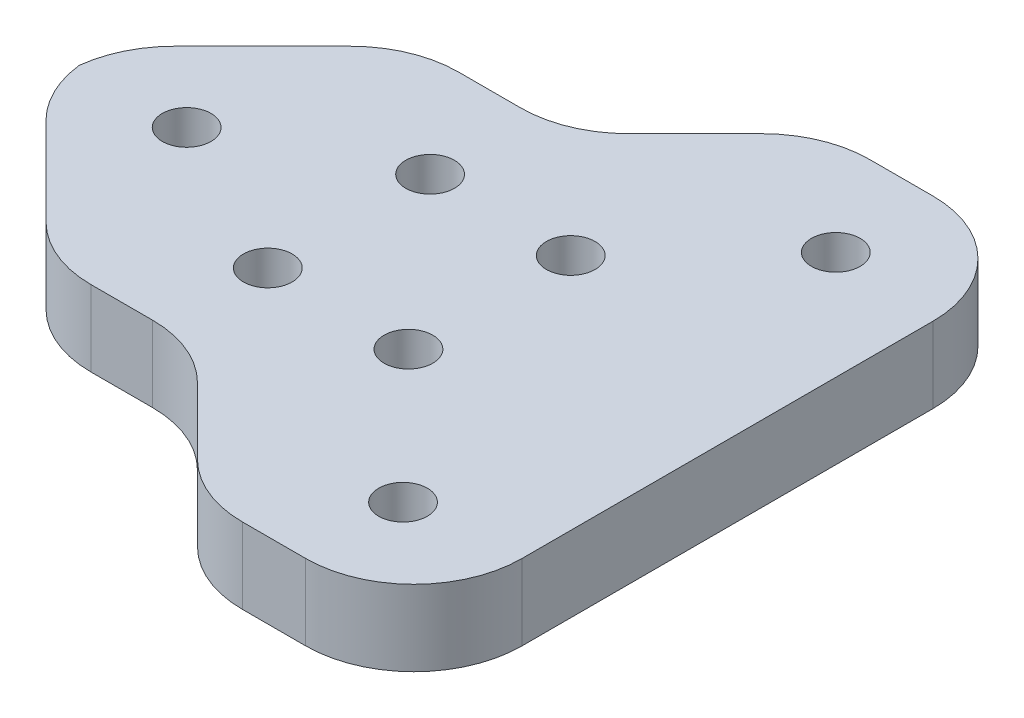
ISO-10303-21;
HEADER;
FILE_DESCRIPTION(('STEP AP214'),'2;1');
FILE_NAME('part.step','',(''),(''),'','','');
FILE_SCHEMA(('AUTOMOTIVE_DESIGN { 1 0 10303 214 1 1 1 1 }'));
ENDSEC;
DATA;
#1=APPLICATION_CONTEXT('core data for automotive mechanical design processes');
#2=APPLICATION_PROTOCOL_DEFINITION('international standard','automotive_design',2000,#1);
#3=PRODUCT_CONTEXT('',#1,'mechanical');
#4=PRODUCT('Part','Part','',(#3));
#5=PRODUCT_RELATED_PRODUCT_CATEGORY('part','',(#4));
#6=PRODUCT_DEFINITION_FORMATION('','',#4);
#7=PRODUCT_DEFINITION_CONTEXT('part definition',#1,'design');
#8=PRODUCT_DEFINITION('design','',#6,#7);
#9=PRODUCT_DEFINITION_SHAPE('','',#8);
#10=(LENGTH_UNIT() NAMED_UNIT(*) SI_UNIT(.MILLI.,.METRE.));
#11=(NAMED_UNIT(*) PLANE_ANGLE_UNIT() SI_UNIT($,.RADIAN.));
#12=(NAMED_UNIT(*) SI_UNIT($,.STERADIAN.) SOLID_ANGLE_UNIT());
#13=UNCERTAINTY_MEASURE_WITH_UNIT(LENGTH_MEASURE(1.E-05),#10,'distance_accuracy_value','');
#14=(GEOMETRIC_REPRESENTATION_CONTEXT(3) GLOBAL_UNCERTAINTY_ASSIGNED_CONTEXT((#13)) GLOBAL_UNIT_ASSIGNED_CONTEXT((#10,
#11,#12)) REPRESENTATION_CONTEXT('',''));
#15=CARTESIAN_POINT('',(0.,0.,0.));
#16=DIRECTION('',(0.,0.,1.));
#17=DIRECTION('',(1.,0.,0.));
#18=AXIS2_PLACEMENT_3D('',#15,#16,#17);
#19=CARTESIAN_POINT('',(0.,7.,0.));
#20=DIRECTION('',(0.,0.,-1.));
#21=DIRECTION('',(-1.,0.,0.));
#22=AXIS2_PLACEMENT_3D('',#19,#20,#21);
#23=PLANE('',#22);
#24=DIRECTION('',(1.,0.,0.));
#25=VECTOR('',#24,1.);
#26=CARTESIAN_POINT('',(0.,0.,0.));
#27=LINE('',#26,#25);
#28=CARTESIAN_POINT('',(44.1421356237306,0.,0.));
#29=VERTEX_POINT('',#28);
#30=CARTESIAN_POINT('',(50.,0.,0.));
#31=VERTEX_POINT('',#30);
#32=EDGE_CURVE('E204',#29,#31,#27,.T.);
#33=ORIENTED_EDGE('',*,*,#32,.T.);
#34=DIRECTION('',(0.,-1.,0.));
#35=VECTOR('',#34,1.);
#36=CARTESIAN_POINT('',(50.,7.,0.));
#37=LINE('',#36,#35);
#38=CARTESIAN_POINT('',(50.,7.,0.));
#39=VERTEX_POINT('',#38);
#40=EDGE_CURVE('E178',#31,#39,#37,.F.);
#41=ORIENTED_EDGE('',*,*,#40,.T.);
#42=DIRECTION('',(1.,0.,0.));
#43=VECTOR('',#42,1.);
#44=CARTESIAN_POINT('',(0.,7.,0.));
#45=LINE('',#44,#43);
#46=CARTESIAN_POINT('',(44.1421356237306,7.,0.));
#47=VERTEX_POINT('',#46);
#48=EDGE_CURVE('E209',#47,#39,#45,.T.);
#49=ORIENTED_EDGE('',*,*,#48,.F.);
#50=DIRECTION('',(0.,-1.,0.));
#51=VECTOR('',#50,1.);
#52=CARTESIAN_POINT('',(44.1421356237306,7.,0.));
#53=LINE('',#52,#51);
#54=EDGE_CURVE('E184',#47,#29,#53,.T.);
#55=ORIENTED_EDGE('',*,*,#54,.T.);
#56=EDGE_LOOP('',(#33,#41,#49,#55));
#57=FACE_BOUND('',#56,.T.);
#58=ADVANCED_FACE('F39',(#57),#23,.F.);
#59=CARTESIAN_POINT('',(60.,7.,0.));
#60=DIRECTION('',(-1.,0.,0.));
#61=DIRECTION('',(0.,0.,1.));
#62=AXIS2_PLACEMENT_3D('',#59,#60,#61);
#63=PLANE('',#62);
#64=DIRECTION('',(0.,0.,-1.));
#65=VECTOR('',#64,1.);
#66=CARTESIAN_POINT('',(60.,7.,0.));
#67=LINE('',#66,#65);
#68=CARTESIAN_POINT('',(60.,7.,-10.));
#69=VERTEX_POINT('',#68);
#70=CARTESIAN_POINT('',(60.,7.,-48.));
#71=VERTEX_POINT('',#70);
#72=EDGE_CURVE('E194',#69,#71,#67,.T.);
#73=ORIENTED_EDGE('',*,*,#72,.F.);
#74=DIRECTION('',(0.,-1.,0.));
#75=VECTOR('',#74,1.);
#76=CARTESIAN_POINT('',(60.,7.,-10.));
#77=LINE('',#76,#75);
#78=CARTESIAN_POINT('',(60.,0.,-10.));
#79=VERTEX_POINT('',#78);
#80=EDGE_CURVE('E177',#69,#79,#77,.T.);
#81=ORIENTED_EDGE('',*,*,#80,.T.);
#82=DIRECTION('',(0.,0.,-1.));
#83=VECTOR('',#82,1.);
#84=CARTESIAN_POINT('',(60.,0.,0.));
#85=LINE('',#84,#83);
#86=CARTESIAN_POINT('',(60.,0.,-48.));
#87=VERTEX_POINT('',#86);
#88=EDGE_CURVE('E191',#79,#87,#85,.T.);
#89=ORIENTED_EDGE('',*,*,#88,.T.);
#90=DIRECTION('',(0.,-1.,0.));
#91=VECTOR('',#90,1.);
#92=CARTESIAN_POINT('',(60.,7.,-48.));
#93=LINE('',#92,#91);
#94=EDGE_CURVE('E197',#87,#71,#93,.F.);
#95=ORIENTED_EDGE('',*,*,#94,.T.);
#96=EDGE_LOOP('',(#73,#81,#89,#95));
#97=FACE_BOUND('',#96,.T.);
#98=ADVANCED_FACE('F190',(#97),#63,.F.);
#99=CARTESIAN_POINT('',(0.,7.,-58.));
#100=DIRECTION('',(0.,0.,1.));
#101=DIRECTION('',(1.,0.,0.));
#102=AXIS2_PLACEMENT_3D('',#99,#100,#101);
#103=PLANE('',#102);
#104=DIRECTION('',(-1.,0.,0.));
#105=VECTOR('',#104,1.);
#106=CARTESIAN_POINT('',(0.,7.,-58.));
#107=LINE('',#106,#105);
#108=CARTESIAN_POINT('',(50.,7.,-58.));
#109=VERTEX_POINT('',#108);
#110=CARTESIAN_POINT('',(44.1421356237306,7.,-58.));
#111=VERTEX_POINT('',#110);
#112=EDGE_CURVE('E216',#109,#111,#107,.T.);
#113=ORIENTED_EDGE('',*,*,#112,.F.);
#114=DIRECTION('',(0.,-1.,0.));
#115=VECTOR('',#114,1.);
#116=CARTESIAN_POINT('',(50.,7.,-58.));
#117=LINE('',#116,#115);
#118=CARTESIAN_POINT('',(50.,0.,-58.));
#119=VERTEX_POINT('',#118);
#120=EDGE_CURVE('E268',#109,#119,#117,.T.);
#121=ORIENTED_EDGE('',*,*,#120,.T.);
#122=DIRECTION('',(-1.,0.,0.));
#123=VECTOR('',#122,1.);
#124=CARTESIAN_POINT('',(0.,0.,-58.));
#125=LINE('',#124,#123);
#126=CARTESIAN_POINT('',(44.1421356237306,0.,-58.));
#127=VERTEX_POINT('',#126);
#128=EDGE_CURVE('E203',#119,#127,#125,.T.);
#129=ORIENTED_EDGE('',*,*,#128,.T.);
#130=DIRECTION('',(0.,-1.,0.));
#131=VECTOR('',#130,1.);
#132=CARTESIAN_POINT('',(44.1421356237306,7.,-58.));
#133=LINE('',#132,#131);
#134=EDGE_CURVE('E265',#127,#111,#133,.F.);
#135=ORIENTED_EDGE('',*,*,#134,.T.);
#136=EDGE_LOOP('',(#113,#121,#129,#135));
#137=FACE_BOUND('',#136,.T.);
#138=ADVANCED_FACE('F505',(#137),#103,.F.);
#139=CARTESIAN_POINT('',(0.,7.,0.));
#140=DIRECTION('',(0.,-1.,0.));
#141=DIRECTION('',(0.,0.,-1.));
#142=AXIS2_PLACEMENT_3D('',#139,#140,#141);
#143=PLANE('',#142);
#144=CARTESIAN_POINT('',(50.,7.,-49.));
#145=DIRECTION('',(0.,-1.,0.));
#146=DIRECTION('',(0.,0.,-1.));
#147=AXIS2_PLACEMENT_3D('',#144,#145,#146);
#148=CIRCLE('',#147,2.25);
#149=CARTESIAN_POINT('',(50.,7.,-51.25));
#150=VERTEX_POINT('',#149);
#151=EDGE_CURVE('E354',#150,#150,#148,.T.);
#152=ORIENTED_EDGE('',*,*,#151,.T.);
#153=EDGE_LOOP('',(#152));
#154=FACE_BOUND('',#153,.T.);
#155=CARTESIAN_POINT('',(50.,7.,-9.00000000000001));
#156=DIRECTION('',(0.,-1.,0.));
#157=DIRECTION('',(0.,0.,-1.));
#158=AXIS2_PLACEMENT_3D('',#155,#156,#157);
#159=CIRCLE('',#158,2.25);
#160=CARTESIAN_POINT('',(50.,7.,-11.25));
#161=VERTEX_POINT('',#160);
#162=EDGE_CURVE('E394',#161,#161,#159,.T.);
#163=ORIENTED_EDGE('',*,*,#162,.T.);
#164=EDGE_LOOP('',(#163));
#165=FACE_BOUND('',#164,.T.);
#166=CARTESIAN_POINT('',(10.,7.,-29.));
#167=DIRECTION('',(0.,-1.,0.));
#168=DIRECTION('',(0.,0.,-1.));
#169=AXIS2_PLACEMENT_3D('',#166,#167,#168);
#170=CIRCLE('',#169,2.25);
#171=CARTESIAN_POINT('',(10.,7.,-31.25));
#172=VERTEX_POINT('',#171);
#173=EDGE_CURVE('E402',#172,#172,#170,.T.);
#174=ORIENTED_EDGE('',*,*,#173,.T.);
#175=EDGE_LOOP('',(#174));
#176=FACE_BOUND('',#175,.T.);
#177=CARTESIAN_POINT('',(38.,7.,-36.5));
#178=DIRECTION('',(0.,-1.,0.));
#179=DIRECTION('',(0.,0.,-1.));
#180=AXIS2_PLACEMENT_3D('',#177,#178,#179);
#181=CIRCLE('',#180,2.25);
#182=CARTESIAN_POINT('',(38.,7.,-38.75));
#183=VERTEX_POINT('',#182);
#184=EDGE_CURVE('E410',#183,#183,#181,.T.);
#185=ORIENTED_EDGE('',*,*,#184,.T.);
#186=EDGE_LOOP('',(#185));
#187=FACE_BOUND('',#186,.T.);
#188=CARTESIAN_POINT('',(38.,7.,-21.5));
#189=DIRECTION('',(0.,-1.,0.));
#190=DIRECTION('',(0.,0.,-1.));
#191=AXIS2_PLACEMENT_3D('',#188,#189,#190);
#192=CIRCLE('',#191,2.25);
#193=CARTESIAN_POINT('',(38.,7.,-23.75));
#194=VERTEX_POINT('',#193);
#195=EDGE_CURVE('E418',#194,#194,#192,.T.);
#196=ORIENTED_EDGE('',*,*,#195,.T.);
#197=EDGE_LOOP('',(#196));
#198=FACE_BOUND('',#197,.T.);
#199=CARTESIAN_POINT('',(25.,7.,-36.5));
#200=DIRECTION('',(0.,-1.,0.));
#201=DIRECTION('',(0.,0.,-1.));
#202=AXIS2_PLACEMENT_3D('',#199,#200,#201);
#203=CIRCLE('',#202,2.25);
#204=CARTESIAN_POINT('',(25.,7.,-38.75));
#205=VERTEX_POINT('',#204);
#206=EDGE_CURVE('E426',#205,#205,#203,.T.);
#207=ORIENTED_EDGE('',*,*,#206,.T.);
#208=EDGE_LOOP('',(#207));
#209=FACE_BOUND('',#208,.T.);
#210=CARTESIAN_POINT('',(25.,7.,-21.5));
#211=DIRECTION('',(0.,-1.,0.));
#212=DIRECTION('',(0.,0.,-1.));
#213=AXIS2_PLACEMENT_3D('',#210,#211,#212);
#214=CIRCLE('',#213,2.25);
#215=CARTESIAN_POINT('',(25.,7.,-23.75));
#216=VERTEX_POINT('',#215);
#217=EDGE_CURVE('E211',#216,#216,#214,.T.);
#218=ORIENTED_EDGE('',*,*,#217,.T.);
#219=EDGE_LOOP('',(#218));
#220=FACE_BOUND('',#219,.T.);
#221=ORIENTED_EDGE('',*,*,#48,.T.);
#222=CARTESIAN_POINT('',(50.,7.,-10.));
#223=DIRECTION('',(0.,-1.,0.));
#224=DIRECTION('',(0.,0.,-1.));
#225=AXIS2_PLACEMENT_3D('',#222,#223,#224);
#226=CIRCLE('',#225,10.);
#227=EDGE_CURVE('E262',#39,#69,#226,.F.);
#228=ORIENTED_EDGE('',*,*,#227,.T.);
#229=ORIENTED_EDGE('',*,*,#72,.T.);
#230=CARTESIAN_POINT('',(50.,7.,-48.));
#231=DIRECTION('',(0.,-1.,0.));
#232=DIRECTION('',(0.,0.,-1.));
#233=AXIS2_PLACEMENT_3D('',#230,#231,#232);
#234=CIRCLE('',#233,10.);
#235=EDGE_CURVE('E259',#71,#109,#234,.F.);
#236=ORIENTED_EDGE('',*,*,#235,.T.);
#237=ORIENTED_EDGE('',*,*,#112,.T.);
#238=CARTESIAN_POINT('',(44.1421356237306,7.,-48.));
#239=DIRECTION('',(0.,-1.,0.));
#240=DIRECTION('',(0.,0.,-1.));
#241=AXIS2_PLACEMENT_3D('',#238,#239,#240);
#242=CIRCLE('',#241,10.);
#243=CARTESIAN_POINT('',(37.071067811865,7.,-55.0710678118654));
#244=VERTEX_POINT('',#243);
#245=EDGE_CURVE('E256',#111,#244,#242,.F.);
#246=ORIENTED_EDGE('',*,*,#245,.T.);
#247=DIRECTION('',(-0.707106781186541,0.,0.707106781186554));
#248=VECTOR('',#247,1.);
#249=CARTESIAN_POINT('',(39.9999999999996,7.,-58.));
#250=LINE('',#249,#248);
#251=CARTESIAN_POINT('',(30.9289321881343,7.,-48.9289321881346));
#252=VERTEX_POINT('',#251);
#253=EDGE_CURVE('E368',#244,#252,#250,.T.);
#254=ORIENTED_EDGE('',*,*,#253,.T.);
#255=CARTESIAN_POINT('',(23.8578643762688,7.,-56.));
#256=DIRECTION('',(0.,-1.,0.));
#257=DIRECTION('',(0.,0.,-1.));
#258=AXIS2_PLACEMENT_3D('',#255,#256,#257);
#259=CIRCLE('',#258,10.);
#260=CARTESIAN_POINT('',(23.8578643762688,7.,-46.));
#261=VERTEX_POINT('',#260);
#262=EDGE_CURVE('E316',#252,#261,#259,.T.);
#263=ORIENTED_EDGE('',*,*,#262,.T.);
#264=DIRECTION('',(-1.,0.,0.));
#265=VECTOR('',#264,1.);
#266=CARTESIAN_POINT('',(27.9999999999998,7.,-46.));
#267=LINE('',#266,#265);
#268=CARTESIAN_POINT('',(18.1421356237308,7.,-46.));
#269=VERTEX_POINT('',#268);
#270=EDGE_CURVE('E361',#261,#269,#267,.T.);
#271=ORIENTED_EDGE('',*,*,#270,.T.);
#272=CARTESIAN_POINT('',(18.1421356237308,7.,-36.));
#273=DIRECTION('',(0.,-1.,0.));
#274=DIRECTION('',(0.,0.,-1.));
#275=AXIS2_PLACEMENT_3D('',#272,#273,#274);
#276=CIRCLE('',#275,10.);
#277=CARTESIAN_POINT('',(11.0710678118652,7.,-43.0710678118654));
#278=VERTEX_POINT('',#277);
#279=EDGE_CURVE('E253',#269,#278,#276,.F.);
#280=ORIENTED_EDGE('',*,*,#279,.T.);
#281=DIRECTION('',(-0.707106781186541,0.,0.707106781186554));
#282=VECTOR('',#281,1.);
#283=CARTESIAN_POINT('',(13.9999999999998,7.,-46.));
#284=LINE('',#283,#282);
#285=CARTESIAN_POINT('',(2.92893218813446,7.,-34.9289321881345));
#286=VERTEX_POINT('',#285);
#287=EDGE_CURVE('E365',#278,#286,#284,.T.);
#288=ORIENTED_EDGE('',*,*,#287,.T.);
#289=CARTESIAN_POINT('',(10.,7.,-27.8578643762691));
#290=DIRECTION('',(0.,-1.,0.));
#291=DIRECTION('',(0.,0.,-1.));
#292=AXIS2_PLACEMENT_3D('',#289,#290,#291);
#293=CIRCLE('',#292,10.);
#294=CARTESIAN_POINT('',(0.065437794396531,7.,-29.));
#295=VERTEX_POINT('',#294);
#296=EDGE_CURVE('E56',#286,#295,#293,.F.);
#297=ORIENTED_EDGE('',*,*,#296,.T.);
#298=CARTESIAN_POINT('',(10.,7.,-30.1421356237309));
#299=DIRECTION('',(0.,-1.,0.));
#300=DIRECTION('',(0.,0.,-1.));
#301=AXIS2_PLACEMENT_3D('',#298,#299,#300);
#302=CIRCLE('',#301,10.);
#303=CARTESIAN_POINT('',(2.92893218813446,7.,-23.0710678118655));
#304=VERTEX_POINT('',#303);
#305=EDGE_CURVE('E248',#295,#304,#302,.F.);
#306=ORIENTED_EDGE('',*,*,#305,.T.);
#307=DIRECTION('',(0.707106781186542,0.,0.707106781186554));
#308=VECTOR('',#307,1.);
#309=CARTESIAN_POINT('',(13.9999999999998,7.,-12.));
#310=LINE('',#309,#308);
#311=CARTESIAN_POINT('',(11.0710678118652,7.,-14.9289321881346));
#312=VERTEX_POINT('',#311);
#313=EDGE_CURVE('E356',#304,#312,#310,.T.);
#314=ORIENTED_EDGE('',*,*,#313,.T.);
#315=CARTESIAN_POINT('',(18.1421356237308,7.,-22.));
#316=DIRECTION('',(0.,-1.,0.));
#317=DIRECTION('',(0.,0.,-1.));
#318=AXIS2_PLACEMENT_3D('',#315,#316,#317);
#319=CIRCLE('',#318,10.);
#320=CARTESIAN_POINT('',(18.1421356237308,7.,-12.));
#321=VERTEX_POINT('',#320);
#322=EDGE_CURVE('E245',#312,#321,#319,.F.);
#323=ORIENTED_EDGE('',*,*,#322,.T.);
#324=DIRECTION('',(1.,0.,0.));
#325=VECTOR('',#324,1.);
#326=CARTESIAN_POINT('',(27.9999999999998,7.,-12.));
#327=LINE('',#326,#325);
#328=CARTESIAN_POINT('',(23.8578643762688,7.,-12.));
#329=VERTEX_POINT('',#328);
#330=EDGE_CURVE('E344',#321,#329,#327,.T.);
#331=ORIENTED_EDGE('',*,*,#330,.T.);
#332=CARTESIAN_POINT('',(23.8578643762688,7.,-2.));
#333=DIRECTION('',(0.,-1.,0.));
#334=DIRECTION('',(0.,0.,-1.));
#335=AXIS2_PLACEMENT_3D('',#332,#333,#334);
#336=CIRCLE('',#335,10.);
#337=CARTESIAN_POINT('',(30.9289321881343,7.,-9.07106781186542));
#338=VERTEX_POINT('',#337);
#339=EDGE_CURVE('E11',#329,#338,#336,.T.);
#340=ORIENTED_EDGE('',*,*,#339,.T.);
#341=DIRECTION('',(0.707106781186542,0.,0.707106781186553));
#342=VECTOR('',#341,1.);
#343=CARTESIAN_POINT('',(39.9999999999996,7.,0.));
#344=LINE('',#343,#342);
#345=CARTESIAN_POINT('',(37.071067811865,7.,-2.92893218813459));
#346=VERTEX_POINT('',#345);
#347=EDGE_CURVE('E342',#338,#346,#344,.T.);
#348=ORIENTED_EDGE('',*,*,#347,.T.);
#349=CARTESIAN_POINT('',(44.1421356237306,7.,-10.));
#350=DIRECTION('',(0.,-1.,0.));
#351=DIRECTION('',(0.,0.,-1.));
#352=AXIS2_PLACEMENT_3D('',#349,#350,#351);
#353=CIRCLE('',#352,10.);
#354=EDGE_CURVE('E242',#346,#47,#353,.F.);
#355=ORIENTED_EDGE('',*,*,#354,.T.);
#356=EDGE_LOOP('',(#221,#228,#229,#236,#237,#246,#254,#263,#271,#280,#288,#297,#306,#314,#323,
#331,#340,#348,#355));
#357=FACE_BOUND('',#356,.T.);
#358=ADVANCED_FACE('F341',(#154,#165,#176,#187,#198,#209,#220,#357),#143,.F.);
#359=CARTESIAN_POINT('',(0.,0.,0.));
#360=DIRECTION('',(0.,-1.,0.));
#361=DIRECTION('',(0.,0.,-1.));
#362=AXIS2_PLACEMENT_3D('',#359,#360,#361);
#363=PLANE('',#362);
#364=ORIENTED_EDGE('',*,*,#88,.F.);
#365=CARTESIAN_POINT('',(50.,0.,-10.));
#366=DIRECTION('',(0.,-1.,0.));
#367=DIRECTION('',(0.,0.,-1.));
#368=AXIS2_PLACEMENT_3D('',#365,#366,#367);
#369=CIRCLE('',#368,10.);
#370=EDGE_CURVE('E173',#79,#31,#369,.T.);
#371=ORIENTED_EDGE('',*,*,#370,.T.);
#372=ORIENTED_EDGE('',*,*,#32,.F.);
#373=CARTESIAN_POINT('',(44.1421356237306,0.,-10.));
#374=DIRECTION('',(0.,-1.,0.));
#375=DIRECTION('',(0.,0.,-1.));
#376=AXIS2_PLACEMENT_3D('',#373,#374,#375);
#377=CIRCLE('',#376,10.);
#378=CARTESIAN_POINT('',(37.071067811865,0.,-2.92893218813459));
#379=VERTEX_POINT('',#378);
#380=EDGE_CURVE('E196',#29,#379,#377,.T.);
#381=ORIENTED_EDGE('',*,*,#380,.T.);
#382=DIRECTION('',(0.707106781186542,0.,0.707106781186553));
#383=VECTOR('',#382,1.);
#384=CARTESIAN_POINT('',(39.9999999999996,0.,0.));
#385=LINE('',#384,#383);
#386=CARTESIAN_POINT('',(30.9289321881343,0.,-9.07106781186542));
#387=VERTEX_POINT('',#386);
#388=EDGE_CURVE('E325',#387,#379,#385,.T.);
#389=ORIENTED_EDGE('',*,*,#388,.F.);
#390=CARTESIAN_POINT('',(23.8578643762688,0.,-2.));
#391=DIRECTION('',(0.,-1.,0.));
#392=DIRECTION('',(0.,0.,-1.));
#393=AXIS2_PLACEMENT_3D('',#390,#391,#392);
#394=CIRCLE('',#393,10.);
#395=CARTESIAN_POINT('',(23.8578643762688,0.,-12.));
#396=VERTEX_POINT('',#395);
#397=EDGE_CURVE('E49',#387,#396,#394,.F.);
#398=ORIENTED_EDGE('',*,*,#397,.T.);
#399=DIRECTION('',(1.,0.,0.));
#400=VECTOR('',#399,1.);
#401=CARTESIAN_POINT('',(27.9999999999998,0.,-12.));
#402=LINE('',#401,#400);
#403=CARTESIAN_POINT('',(18.1421356237308,0.,-12.));
#404=VERTEX_POINT('',#403);
#405=EDGE_CURVE('E323',#404,#396,#402,.T.);
#406=ORIENTED_EDGE('',*,*,#405,.F.);
#407=CARTESIAN_POINT('',(18.1421356237308,0.,-22.));
#408=DIRECTION('',(0.,-1.,0.));
#409=DIRECTION('',(0.,0.,-1.));
#410=AXIS2_PLACEMENT_3D('',#407,#408,#409);
#411=CIRCLE('',#410,10.);
#412=CARTESIAN_POINT('',(11.0710678118652,0.,-14.9289321881346));
#413=VERTEX_POINT('',#412);
#414=EDGE_CURVE('E220',#404,#413,#411,.T.);
#415=ORIENTED_EDGE('',*,*,#414,.T.);
#416=DIRECTION('',(0.707106781186542,0.,0.707106781186554));
#417=VECTOR('',#416,1.);
#418=CARTESIAN_POINT('',(13.9999999999998,0.,-12.));
#419=LINE('',#418,#417);
#420=CARTESIAN_POINT('',(2.92893218813446,0.,-23.0710678118655));
#421=VERTEX_POINT('',#420);
#422=EDGE_CURVE('E335',#421,#413,#419,.T.);
#423=ORIENTED_EDGE('',*,*,#422,.F.);
#424=CARTESIAN_POINT('',(10.,0.,-30.1421356237309));
#425=DIRECTION('',(0.,-1.,0.));
#426=DIRECTION('',(0.,0.,-1.));
#427=AXIS2_PLACEMENT_3D('',#424,#425,#426);
#428=CIRCLE('',#427,10.);
#429=CARTESIAN_POINT('',(0.065437794396531,0.,-29.));
#430=VERTEX_POINT('',#429);
#431=EDGE_CURVE('E223',#421,#430,#428,.T.);
#432=ORIENTED_EDGE('',*,*,#431,.T.);
#433=CARTESIAN_POINT('',(10.,0.,-27.8578643762691));
#434=DIRECTION('',(0.,-1.,0.));
#435=DIRECTION('',(0.,0.,-1.));
#436=AXIS2_PLACEMENT_3D('',#433,#434,#435);
#437=CIRCLE('',#436,10.);
#438=CARTESIAN_POINT('',(2.92893218813446,0.,-34.9289321881345));
#439=VERTEX_POINT('',#438);
#440=EDGE_CURVE('E226',#430,#439,#437,.T.);
#441=ORIENTED_EDGE('',*,*,#440,.T.);
#442=DIRECTION('',(-0.707106781186541,0.,0.707106781186554));
#443=VECTOR('',#442,1.);
#444=CARTESIAN_POINT('',(13.9999999999998,0.,-46.));
#445=LINE('',#444,#443);
#446=CARTESIAN_POINT('',(11.0710678118652,0.,-43.0710678118654));
#447=VERTEX_POINT('',#446);
#448=EDGE_CURVE('E376',#447,#439,#445,.T.);
#449=ORIENTED_EDGE('',*,*,#448,.F.);
#450=CARTESIAN_POINT('',(18.1421356237308,0.,-36.));
#451=DIRECTION('',(0.,-1.,0.));
#452=DIRECTION('',(0.,0.,-1.));
#453=AXIS2_PLACEMENT_3D('',#450,#451,#452);
#454=CIRCLE('',#453,10.);
#455=CARTESIAN_POINT('',(18.1421356237308,0.,-46.));
#456=VERTEX_POINT('',#455);
#457=EDGE_CURVE('E229',#447,#456,#454,.T.);
#458=ORIENTED_EDGE('',*,*,#457,.T.);
#459=DIRECTION('',(-1.,0.,0.));
#460=VECTOR('',#459,1.);
#461=CARTESIAN_POINT('',(27.9999999999998,0.,-46.));
#462=LINE('',#461,#460);
#463=CARTESIAN_POINT('',(23.8578643762688,0.,-46.));
#464=VERTEX_POINT('',#463);
#465=EDGE_CURVE('E369',#464,#456,#462,.T.);
#466=ORIENTED_EDGE('',*,*,#465,.F.);
#467=CARTESIAN_POINT('',(23.8578643762688,0.,-56.));
#468=DIRECTION('',(0.,-1.,0.));
#469=DIRECTION('',(0.,0.,-1.));
#470=AXIS2_PLACEMENT_3D('',#467,#468,#469);
#471=CIRCLE('',#470,10.);
#472=CARTESIAN_POINT('',(30.9289321881343,0.,-48.9289321881346));
#473=VERTEX_POINT('',#472);
#474=EDGE_CURVE('E313',#464,#473,#471,.F.);
#475=ORIENTED_EDGE('',*,*,#474,.T.);
#476=DIRECTION('',(-0.707106781186541,0.,0.707106781186554));
#477=VECTOR('',#476,1.);
#478=CARTESIAN_POINT('',(39.9999999999996,0.,-58.));
#479=LINE('',#478,#477);
#480=CARTESIAN_POINT('',(37.071067811865,0.,-55.0710678118654));
#481=VERTEX_POINT('',#480);
#482=EDGE_CURVE('E380',#481,#473,#479,.T.);
#483=ORIENTED_EDGE('',*,*,#482,.F.);
#484=CARTESIAN_POINT('',(44.1421356237306,0.,-48.));
#485=DIRECTION('',(0.,-1.,0.));
#486=DIRECTION('',(0.,0.,-1.));
#487=AXIS2_PLACEMENT_3D('',#484,#485,#486);
#488=CIRCLE('',#487,10.);
#489=EDGE_CURVE('E232',#481,#127,#488,.T.);
#490=ORIENTED_EDGE('',*,*,#489,.T.);
#491=ORIENTED_EDGE('',*,*,#128,.F.);
#492=CARTESIAN_POINT('',(50.,0.,-48.));
#493=DIRECTION('',(0.,-1.,0.));
#494=DIRECTION('',(0.,0.,-1.));
#495=AXIS2_PLACEMENT_3D('',#492,#493,#494);
#496=CIRCLE('',#495,10.);
#497=EDGE_CURVE('E185',#119,#87,#496,.T.);
#498=ORIENTED_EDGE('',*,*,#497,.T.);
#499=EDGE_LOOP('',(#364,#371,#372,#381,#389,#398,#406,#415,#423,#432,#441,#449,#458,#466,#475,
#483,#490,#491,#498));
#500=FACE_BOUND('',#499,.T.);
#501=CARTESIAN_POINT('',(50.,0.,-49.));
#502=DIRECTION('',(0.,-1.,0.));
#503=DIRECTION('',(0.,0.,-1.));
#504=AXIS2_PLACEMENT_3D('',#501,#502,#503);
#505=CIRCLE('',#504,2.24999999999999);
#506=CARTESIAN_POINT('',(50.,0.,-51.25));
#507=VERTEX_POINT('',#506);
#508=EDGE_CURVE('E349',#507,#507,#505,.T.);
#509=ORIENTED_EDGE('',*,*,#508,.F.);
#510=EDGE_LOOP('',(#509));
#511=FACE_BOUND('',#510,.T.);
#512=CARTESIAN_POINT('',(50.,0.,-9.00000000000001));
#513=DIRECTION('',(0.,-1.,0.));
#514=DIRECTION('',(0.,0.,-1.));
#515=AXIS2_PLACEMENT_3D('',#512,#513,#514);
#516=CIRCLE('',#515,2.24999999999999);
#517=CARTESIAN_POINT('',(50.,0.,-11.25));
#518=VERTEX_POINT('',#517);
#519=EDGE_CURVE('E390',#518,#518,#516,.T.);
#520=ORIENTED_EDGE('',*,*,#519,.F.);
#521=EDGE_LOOP('',(#520));
#522=FACE_BOUND('',#521,.T.);
#523=CARTESIAN_POINT('',(10.,0.,-29.));
#524=DIRECTION('',(0.,-1.,0.));
#525=DIRECTION('',(0.,0.,-1.));
#526=AXIS2_PLACEMENT_3D('',#523,#524,#525);
#527=CIRCLE('',#526,2.24999999999999);
#528=CARTESIAN_POINT('',(10.,0.,-31.25));
#529=VERTEX_POINT('',#528);
#530=EDGE_CURVE('E398',#529,#529,#527,.T.);
#531=ORIENTED_EDGE('',*,*,#530,.F.);
#532=EDGE_LOOP('',(#531));
#533=FACE_BOUND('',#532,.T.);
#534=CARTESIAN_POINT('',(38.,0.,-36.5));
#535=DIRECTION('',(0.,-1.,0.));
#536=DIRECTION('',(0.,0.,-1.));
#537=AXIS2_PLACEMENT_3D('',#534,#535,#536);
#538=CIRCLE('',#537,2.24999999999999);
#539=CARTESIAN_POINT('',(38.,0.,-38.75));
#540=VERTEX_POINT('',#539);
#541=EDGE_CURVE('E406',#540,#540,#538,.T.);
#542=ORIENTED_EDGE('',*,*,#541,.F.);
#543=EDGE_LOOP('',(#542));
#544=FACE_BOUND('',#543,.T.);
#545=CARTESIAN_POINT('',(38.,0.,-21.5));
#546=DIRECTION('',(0.,-1.,0.));
#547=DIRECTION('',(0.,0.,-1.));
#548=AXIS2_PLACEMENT_3D('',#545,#546,#547);
#549=CIRCLE('',#548,2.24999999999999);
#550=CARTESIAN_POINT('',(38.,0.,-23.75));
#551=VERTEX_POINT('',#550);
#552=EDGE_CURVE('E414',#551,#551,#549,.T.);
#553=ORIENTED_EDGE('',*,*,#552,.F.);
#554=EDGE_LOOP('',(#553));
#555=FACE_BOUND('',#554,.T.);
#556=CARTESIAN_POINT('',(25.,0.,-36.5));
#557=DIRECTION('',(0.,-1.,0.));
#558=DIRECTION('',(0.,0.,-1.));
#559=AXIS2_PLACEMENT_3D('',#556,#557,#558);
#560=CIRCLE('',#559,2.24999999999999);
#561=CARTESIAN_POINT('',(25.,0.,-38.75));
#562=VERTEX_POINT('',#561);
#563=EDGE_CURVE('E422',#562,#562,#560,.T.);
#564=ORIENTED_EDGE('',*,*,#563,.F.);
#565=EDGE_LOOP('',(#564));
#566=FACE_BOUND('',#565,.T.);
#567=CARTESIAN_POINT('',(25.,0.,-21.5));
#568=DIRECTION('',(0.,-1.,0.));
#569=DIRECTION('',(0.,0.,-1.));
#570=AXIS2_PLACEMENT_3D('',#567,#568,#569);
#571=CIRCLE('',#570,2.24999999999999);
#572=CARTESIAN_POINT('',(25.,0.,-23.75));
#573=VERTEX_POINT('',#572);
#574=EDGE_CURVE('E430',#573,#573,#571,.T.);
#575=ORIENTED_EDGE('',*,*,#574,.F.);
#576=EDGE_LOOP('',(#575));
#577=FACE_BOUND('',#576,.T.);
#578=ADVANCED_FACE('F199',(#500,#511,#522,#533,#544,#555,#566,#577),#363,.T.);
#579=CARTESIAN_POINT('',(25.,0.,-21.5));
#580=DIRECTION('',(0.,-1.,0.));
#581=DIRECTION('',(0.,0.,-1.));
#582=AXIS2_PLACEMENT_3D('',#579,#580,#581);
#583=CYLINDRICAL_SURFACE('',#582,2.24999999999999);
#584=ORIENTED_EDGE('',*,*,#217,.F.);
#585=EDGE_LOOP('',(#584));
#586=FACE_BOUND('',#585,.T.);
#587=ORIENTED_EDGE('',*,*,#574,.T.);
#588=EDGE_LOOP('',(#587));
#589=FACE_BOUND('',#588,.T.);
#590=ADVANCED_FACE('F573',(#586,#589),#583,.F.);
#591=CARTESIAN_POINT('',(25.,0.,-36.5));
#592=DIRECTION('',(0.,-1.,0.));
#593=DIRECTION('',(0.,0.,-1.));
#594=AXIS2_PLACEMENT_3D('',#591,#592,#593);
#595=CYLINDRICAL_SURFACE('',#594,2.24999999999999);
#596=ORIENTED_EDGE('',*,*,#206,.F.);
#597=EDGE_LOOP('',(#596));
#598=FACE_BOUND('',#597,.T.);
#599=ORIENTED_EDGE('',*,*,#563,.T.);
#600=EDGE_LOOP('',(#599));
#601=FACE_BOUND('',#600,.T.);
#602=ADVANCED_FACE('F577',(#598,#601),#595,.F.);
#603=CARTESIAN_POINT('',(38.,0.,-21.5));
#604=DIRECTION('',(0.,-1.,0.));
#605=DIRECTION('',(0.,0.,-1.));
#606=AXIS2_PLACEMENT_3D('',#603,#604,#605);
#607=CYLINDRICAL_SURFACE('',#606,2.24999999999999);
#608=ORIENTED_EDGE('',*,*,#195,.F.);
#609=EDGE_LOOP('',(#608));
#610=FACE_BOUND('',#609,.T.);
#611=ORIENTED_EDGE('',*,*,#552,.T.);
#612=EDGE_LOOP('',(#611));
#613=FACE_BOUND('',#612,.T.);
#614=ADVANCED_FACE('F581',(#610,#613),#607,.F.);
#615=CARTESIAN_POINT('',(38.,0.,-36.5));
#616=DIRECTION('',(0.,-1.,0.));
#617=DIRECTION('',(0.,0.,-1.));
#618=AXIS2_PLACEMENT_3D('',#615,#616,#617);
#619=CYLINDRICAL_SURFACE('',#618,2.24999999999999);
#620=ORIENTED_EDGE('',*,*,#184,.F.);
#621=EDGE_LOOP('',(#620));
#622=FACE_BOUND('',#621,.T.);
#623=ORIENTED_EDGE('',*,*,#541,.T.);
#624=EDGE_LOOP('',(#623));
#625=FACE_BOUND('',#624,.T.);
#626=ADVANCED_FACE('F585',(#622,#625),#619,.F.);
#627=CARTESIAN_POINT('',(10.,0.,-29.));
#628=DIRECTION('',(0.,-1.,0.));
#629=DIRECTION('',(0.,0.,-1.));
#630=AXIS2_PLACEMENT_3D('',#627,#628,#629);
#631=CYLINDRICAL_SURFACE('',#630,2.24999999999999);
#632=ORIENTED_EDGE('',*,*,#173,.F.);
#633=EDGE_LOOP('',(#632));
#634=FACE_BOUND('',#633,.T.);
#635=ORIENTED_EDGE('',*,*,#530,.T.);
#636=EDGE_LOOP('',(#635));
#637=FACE_BOUND('',#636,.T.);
#638=ADVANCED_FACE('F589',(#634,#637),#631,.F.);
#639=CARTESIAN_POINT('',(50.,0.,-9.00000000000001));
#640=DIRECTION('',(0.,-1.,0.));
#641=DIRECTION('',(0.,0.,-1.));
#642=AXIS2_PLACEMENT_3D('',#639,#640,#641);
#643=CYLINDRICAL_SURFACE('',#642,2.25);
#644=ORIENTED_EDGE('',*,*,#162,.F.);
#645=EDGE_LOOP('',(#644));
#646=FACE_BOUND('',#645,.T.);
#647=ORIENTED_EDGE('',*,*,#519,.T.);
#648=EDGE_LOOP('',(#647));
#649=FACE_BOUND('',#648,.T.);
#650=ADVANCED_FACE('F593',(#646,#649),#643,.F.);
#651=CARTESIAN_POINT('',(50.,0.,-49.));
#652=DIRECTION('',(0.,-1.,0.));
#653=DIRECTION('',(0.,0.,-1.));
#654=AXIS2_PLACEMENT_3D('',#651,#652,#653);
#655=CYLINDRICAL_SURFACE('',#654,2.25);
#656=ORIENTED_EDGE('',*,*,#151,.F.);
#657=EDGE_LOOP('',(#656));
#658=FACE_BOUND('',#657,.T.);
#659=ORIENTED_EDGE('',*,*,#508,.T.);
#660=EDGE_LOOP('',(#659));
#661=FACE_BOUND('',#660,.T.);
#662=ADVANCED_FACE('F597',(#658,#661),#655,.F.);
#663=CARTESIAN_POINT('',(13.9999999999998,7.,-46.));
#664=DIRECTION('',(0.707106781186554,0.,0.707106781186541));
#665=DIRECTION('',(0.707106781186541,0.,-0.707106781186554));
#666=AXIS2_PLACEMENT_3D('',#663,#664,#665);
#667=PLANE('',#666);
#668=ORIENTED_EDGE('',*,*,#287,.F.);
#669=DIRECTION('',(0.,-1.,0.));
#670=VECTOR('',#669,1.);
#671=CARTESIAN_POINT('',(11.0710678118652,7.,-43.0710678118654));
#672=LINE('',#671,#670);
#673=EDGE_CURVE('E290',#278,#447,#672,.T.);
#674=ORIENTED_EDGE('',*,*,#673,.T.);
#675=ORIENTED_EDGE('',*,*,#448,.T.);
#676=DIRECTION('',(0.,-1.,0.));
#677=VECTOR('',#676,1.);
#678=CARTESIAN_POINT('',(2.92893218813446,7.,-34.9289321881345));
#679=LINE('',#678,#677);
#680=EDGE_CURVE('E286',#439,#286,#679,.F.);
#681=ORIENTED_EDGE('',*,*,#680,.T.);
#682=EDGE_LOOP('',(#668,#674,#675,#681));
#683=FACE_BOUND('',#682,.T.);
#684=ADVANCED_FACE('F472',(#683),#667,.F.);
#685=CARTESIAN_POINT('',(27.9999999999998,7.,-46.));
#686=DIRECTION('',(0.,0.,1.));
#687=DIRECTION('',(1.,0.,0.));
#688=AXIS2_PLACEMENT_3D('',#685,#686,#687);
#689=PLANE('',#688);
#690=ORIENTED_EDGE('',*,*,#270,.F.);
#691=DIRECTION('',(0.,-1.,0.));
#692=VECTOR('',#691,1.);
#693=CARTESIAN_POINT('',(23.8578643762688,0.,-46.));
#694=LINE('',#693,#692);
#695=EDGE_CURVE('E282',#261,#464,#694,.T.);
#696=ORIENTED_EDGE('',*,*,#695,.T.);
#697=ORIENTED_EDGE('',*,*,#465,.T.);
#698=DIRECTION('',(0.,-1.,0.));
#699=VECTOR('',#698,1.);
#700=CARTESIAN_POINT('',(18.1421356237308,7.,-46.));
#701=LINE('',#700,#699);
#702=EDGE_CURVE('E279',#456,#269,#701,.F.);
#703=ORIENTED_EDGE('',*,*,#702,.T.);
#704=EDGE_LOOP('',(#690,#696,#697,#703));
#705=FACE_BOUND('',#704,.T.);
#706=ADVANCED_FACE('F463',(#705),#689,.F.);
#707=CARTESIAN_POINT('',(39.9999999999996,7.,-58.));
#708=DIRECTION('',(0.707106781186554,0.,0.707106781186541));
#709=DIRECTION('',(0.707106781186541,0.,-0.707106781186554));
#710=AXIS2_PLACEMENT_3D('',#707,#708,#709);
#711=PLANE('',#710);
#712=ORIENTED_EDGE('',*,*,#253,.F.);
#713=DIRECTION('',(0.,-1.,0.));
#714=VECTOR('',#713,1.);
#715=CARTESIAN_POINT('',(37.071067811865,7.,-55.0710678118654));
#716=LINE('',#715,#714);
#717=EDGE_CURVE('E275',#244,#481,#716,.T.);
#718=ORIENTED_EDGE('',*,*,#717,.T.);
#719=ORIENTED_EDGE('',*,*,#482,.T.);
#720=DIRECTION('',(0.,-1.,0.));
#721=VECTOR('',#720,1.);
#722=CARTESIAN_POINT('',(30.9289321881343,7.,-48.9289321881346));
#723=LINE('',#722,#721);
#724=EDGE_CURVE('E272',#473,#252,#723,.F.);
#725=ORIENTED_EDGE('',*,*,#724,.T.);
#726=EDGE_LOOP('',(#712,#718,#719,#725));
#727=FACE_BOUND('',#726,.T.);
#728=ADVANCED_FACE('F454',(#727),#711,.F.);
#729=CARTESIAN_POINT('',(39.9999999999996,7.,0.));
#730=DIRECTION('',(0.707106781186553,0.,-0.707106781186542));
#731=DIRECTION('',(-0.707106781186542,0.,-0.707106781186553));
#732=AXIS2_PLACEMENT_3D('',#729,#730,#731);
#733=PLANE('',#732);
#734=ORIENTED_EDGE('',*,*,#388,.T.);
#735=DIRECTION('',(0.,-1.,0.));
#736=VECTOR('',#735,1.);
#737=CARTESIAN_POINT('',(37.071067811865,7.,-2.92893218813459));
#738=LINE('',#737,#736);
#739=EDGE_CURVE('E310',#379,#346,#738,.F.);
#740=ORIENTED_EDGE('',*,*,#739,.T.);
#741=ORIENTED_EDGE('',*,*,#347,.F.);
#742=DIRECTION('',(0.,-1.,0.));
#743=VECTOR('',#742,1.);
#744=CARTESIAN_POINT('',(30.9289321881343,0.,-9.07106781186542));
#745=LINE('',#744,#743);
#746=EDGE_CURVE('E306',#338,#387,#745,.T.);
#747=ORIENTED_EDGE('',*,*,#746,.T.);
#748=EDGE_LOOP('',(#734,#740,#741,#747));
#749=FACE_BOUND('',#748,.T.);
#750=ADVANCED_FACE('F346',(#749),#733,.F.);
#751=CARTESIAN_POINT('',(27.9999999999998,7.,-12.));
#752=DIRECTION('',(0.,0.,-1.));
#753=DIRECTION('',(-1.,0.,0.));
#754=AXIS2_PLACEMENT_3D('',#751,#752,#753);
#755=PLANE('',#754);
#756=ORIENTED_EDGE('',*,*,#330,.F.);
#757=DIRECTION('',(0.,-1.,0.));
#758=VECTOR('',#757,1.);
#759=CARTESIAN_POINT('',(18.1421356237308,7.,-12.));
#760=LINE('',#759,#758);
#761=EDGE_CURVE('E302',#321,#404,#760,.T.);
#762=ORIENTED_EDGE('',*,*,#761,.T.);
#763=ORIENTED_EDGE('',*,*,#405,.T.);
#764=DIRECTION('',(0.,-1.,0.));
#765=VECTOR('',#764,1.);
#766=CARTESIAN_POINT('',(23.8578643762688,7.,-12.));
#767=LINE('',#766,#765);
#768=EDGE_CURVE('E299',#396,#329,#767,.F.);
#769=ORIENTED_EDGE('',*,*,#768,.T.);
#770=EDGE_LOOP('',(#756,#762,#763,#769));
#771=FACE_BOUND('',#770,.T.);
#772=ADVANCED_FACE('F331',(#771),#755,.F.);
#773=CARTESIAN_POINT('',(13.9999999999998,7.,-12.));
#774=DIRECTION('',(0.707106781186554,0.,-0.707106781186542));
#775=DIRECTION('',(-0.707106781186542,0.,-0.707106781186554));
#776=AXIS2_PLACEMENT_3D('',#773,#774,#775);
#777=PLANE('',#776);
#778=ORIENTED_EDGE('',*,*,#313,.F.);
#779=DIRECTION('',(0.,-1.,0.));
#780=VECTOR('',#779,1.);
#781=CARTESIAN_POINT('',(2.92893218813446,7.,-23.0710678118655));
#782=LINE('',#781,#780);
#783=EDGE_CURVE('E296',#304,#421,#782,.T.);
#784=ORIENTED_EDGE('',*,*,#783,.T.);
#785=ORIENTED_EDGE('',*,*,#422,.T.);
#786=DIRECTION('',(0.,-1.,0.));
#787=VECTOR('',#786,1.);
#788=CARTESIAN_POINT('',(11.0710678118652,7.,-14.9289321881346));
#789=LINE('',#788,#787);
#790=EDGE_CURVE('E64',#413,#312,#789,.F.);
#791=ORIENTED_EDGE('',*,*,#790,.T.);
#792=EDGE_LOOP('',(#778,#784,#785,#791));
#793=FACE_BOUND('',#792,.T.);
#794=ADVANCED_FACE('F488',(#793),#777,.F.);
#795=CARTESIAN_POINT('',(50.,7.,-10.));
#796=DIRECTION('',(0.,-1.,0.));
#797=DIRECTION('',(0.,0.,-1.));
#798=AXIS2_PLACEMENT_3D('',#795,#796,#797);
#799=CYLINDRICAL_SURFACE('',#798,10.);
#800=ORIENTED_EDGE('',*,*,#227,.F.);
#801=ORIENTED_EDGE('',*,*,#40,.F.);
#802=ORIENTED_EDGE('',*,*,#370,.F.);
#803=ORIENTED_EDGE('',*,*,#80,.F.);
#804=EDGE_LOOP('',(#800,#801,#802,#803));
#805=FACE_BOUND('',#804,.T.);
#806=ADVANCED_FACE('F176',(#805),#799,.T.);
#807=CARTESIAN_POINT('',(50.,7.,-48.));
#808=DIRECTION('',(0.,-1.,0.));
#809=DIRECTION('',(0.,0.,-1.));
#810=AXIS2_PLACEMENT_3D('',#807,#808,#809);
#811=CYLINDRICAL_SURFACE('',#810,10.);
#812=ORIENTED_EDGE('',*,*,#235,.F.);
#813=ORIENTED_EDGE('',*,*,#94,.F.);
#814=ORIENTED_EDGE('',*,*,#497,.F.);
#815=ORIENTED_EDGE('',*,*,#120,.F.);
#816=EDGE_LOOP('',(#812,#813,#814,#815));
#817=FACE_BOUND('',#816,.T.);
#818=ADVANCED_FACE('F511',(#817),#811,.T.);
#819=CARTESIAN_POINT('',(44.1421356237306,7.,-48.));
#820=DIRECTION('',(0.,-1.,0.));
#821=DIRECTION('',(0.,0.,-1.));
#822=AXIS2_PLACEMENT_3D('',#819,#820,#821);
#823=CYLINDRICAL_SURFACE('',#822,10.);
#824=ORIENTED_EDGE('',*,*,#245,.F.);
#825=ORIENTED_EDGE('',*,*,#134,.F.);
#826=ORIENTED_EDGE('',*,*,#489,.F.);
#827=ORIENTED_EDGE('',*,*,#717,.F.);
#828=EDGE_LOOP('',(#824,#825,#826,#827));
#829=FACE_BOUND('',#828,.T.);
#830=ADVANCED_FACE('F451',(#829),#823,.T.);
#831=CARTESIAN_POINT('',(23.8578643762688,7.,-56.));
#832=DIRECTION('',(0.,1.,0.));
#833=DIRECTION('',(0.,0.,1.));
#834=AXIS2_PLACEMENT_3D('',#831,#832,#833);
#835=CYLINDRICAL_SURFACE('',#834,10.);
#836=ORIENTED_EDGE('',*,*,#262,.F.);
#837=ORIENTED_EDGE('',*,*,#724,.F.);
#838=ORIENTED_EDGE('',*,*,#474,.F.);
#839=ORIENTED_EDGE('',*,*,#695,.F.);
#840=EDGE_LOOP('',(#836,#837,#838,#839));
#841=FACE_BOUND('',#840,.T.);
#842=ADVANCED_FACE('F460',(#841),#835,.F.);
#843=CARTESIAN_POINT('',(18.1421356237308,7.,-36.));
#844=DIRECTION('',(0.,-1.,0.));
#845=DIRECTION('',(0.,0.,-1.));
#846=AXIS2_PLACEMENT_3D('',#843,#844,#845);
#847=CYLINDRICAL_SURFACE('',#846,10.);
#848=ORIENTED_EDGE('',*,*,#279,.F.);
#849=ORIENTED_EDGE('',*,*,#702,.F.);
#850=ORIENTED_EDGE('',*,*,#457,.F.);
#851=ORIENTED_EDGE('',*,*,#673,.F.);
#852=EDGE_LOOP('',(#848,#849,#850,#851));
#853=FACE_BOUND('',#852,.T.);
#854=ADVANCED_FACE('F469',(#853),#847,.T.);
#855=CARTESIAN_POINT('',(10.,7.,-30.1421356237309));
#856=DIRECTION('',(0.,-1.,0.));
#857=DIRECTION('',(0.,0.,-1.));
#858=AXIS2_PLACEMENT_3D('',#855,#856,#857);
#859=CYLINDRICAL_SURFACE('',#858,10.);
#860=ORIENTED_EDGE('',*,*,#783,.F.);
#861=ORIENTED_EDGE('',*,*,#305,.F.);
#862=DIRECTION('',(0.,-1.,0.));
#863=VECTOR('',#862,1.);
#864=CARTESIAN_POINT('',(0.065437794396531,3.5,-29.));
#865=LINE('',#864,#863);
#866=EDGE_CURVE('E43',#430,#295,#865,.F.);
#867=ORIENTED_EDGE('',*,*,#866,.F.);
#868=ORIENTED_EDGE('',*,*,#431,.F.);
#869=EDGE_LOOP('',(#860,#861,#867,#868));
#870=FACE_BOUND('',#869,.T.);
#871=ADVANCED_FACE('F489',(#870),#859,.T.);
#872=CARTESIAN_POINT('',(10.,7.,-27.8578643762691));
#873=DIRECTION('',(0.,-1.,0.));
#874=DIRECTION('',(0.,0.,-1.));
#875=AXIS2_PLACEMENT_3D('',#872,#873,#874);
#876=CYLINDRICAL_SURFACE('',#875,10.);
#877=ORIENTED_EDGE('',*,*,#296,.F.);
#878=ORIENTED_EDGE('',*,*,#680,.F.);
#879=ORIENTED_EDGE('',*,*,#440,.F.);
#880=ORIENTED_EDGE('',*,*,#866,.T.);
#881=EDGE_LOOP('',(#877,#878,#879,#880));
#882=FACE_BOUND('',#881,.T.);
#883=ADVANCED_FACE('F480',(#882),#876,.T.);
#884=CARTESIAN_POINT('',(18.1421356237308,7.,-22.));
#885=DIRECTION('',(0.,-1.,0.));
#886=DIRECTION('',(0.,0.,-1.));
#887=AXIS2_PLACEMENT_3D('',#884,#885,#886);
#888=CYLINDRICAL_SURFACE('',#887,10.);
#889=ORIENTED_EDGE('',*,*,#322,.F.);
#890=ORIENTED_EDGE('',*,*,#790,.F.);
#891=ORIENTED_EDGE('',*,*,#414,.F.);
#892=ORIENTED_EDGE('',*,*,#761,.F.);
#893=EDGE_LOOP('',(#889,#890,#891,#892));
#894=FACE_BOUND('',#893,.T.);
#895=ADVANCED_FACE('F487',(#894),#888,.T.);
#896=CARTESIAN_POINT('',(44.1421356237306,7.,-10.));
#897=DIRECTION('',(0.,-1.,0.));
#898=DIRECTION('',(0.,0.,-1.));
#899=AXIS2_PLACEMENT_3D('',#896,#897,#898);
#900=CYLINDRICAL_SURFACE('',#899,10.);
#901=ORIENTED_EDGE('',*,*,#354,.F.);
#902=ORIENTED_EDGE('',*,*,#739,.F.);
#903=ORIENTED_EDGE('',*,*,#380,.F.);
#904=ORIENTED_EDGE('',*,*,#54,.F.);
#905=EDGE_LOOP('',(#901,#902,#903,#904));
#906=FACE_BOUND('',#905,.T.);
#907=ADVANCED_FACE('F545',(#906),#900,.T.);
#908=CARTESIAN_POINT('',(23.8578643762688,7.,-2.));
#909=DIRECTION('',(0.,1.,0.));
#910=DIRECTION('',(0.,0.,1.));
#911=AXIS2_PLACEMENT_3D('',#908,#909,#910);
#912=CYLINDRICAL_SURFACE('',#911,10.);
#913=ORIENTED_EDGE('',*,*,#339,.F.);
#914=ORIENTED_EDGE('',*,*,#768,.F.);
#915=ORIENTED_EDGE('',*,*,#397,.F.);
#916=ORIENTED_EDGE('',*,*,#746,.F.);
#917=EDGE_LOOP('',(#913,#914,#915,#916));
#918=FACE_BOUND('',#917,.T.);
#919=ADVANCED_FACE('F41',(#918),#912,.F.);
#920=CLOSED_SHELL('',(#58,#98,#138,#358,#578,#590,#602,#614,#626,#638,#650,#662,#684,#706,#728,
#750,#772,#794,#806,#818,#830,#842,#854,#871,#883,#895,#907,#919));
#921=MANIFOLD_SOLID_BREP('B2',#920);
#922=ADVANCED_BREP_SHAPE_REPRESENTATION('',(#18,#921),#14);
#923=SHAPE_DEFINITION_REPRESENTATION(#9,#922);
ENDSEC;
END-ISO-10303-21;
